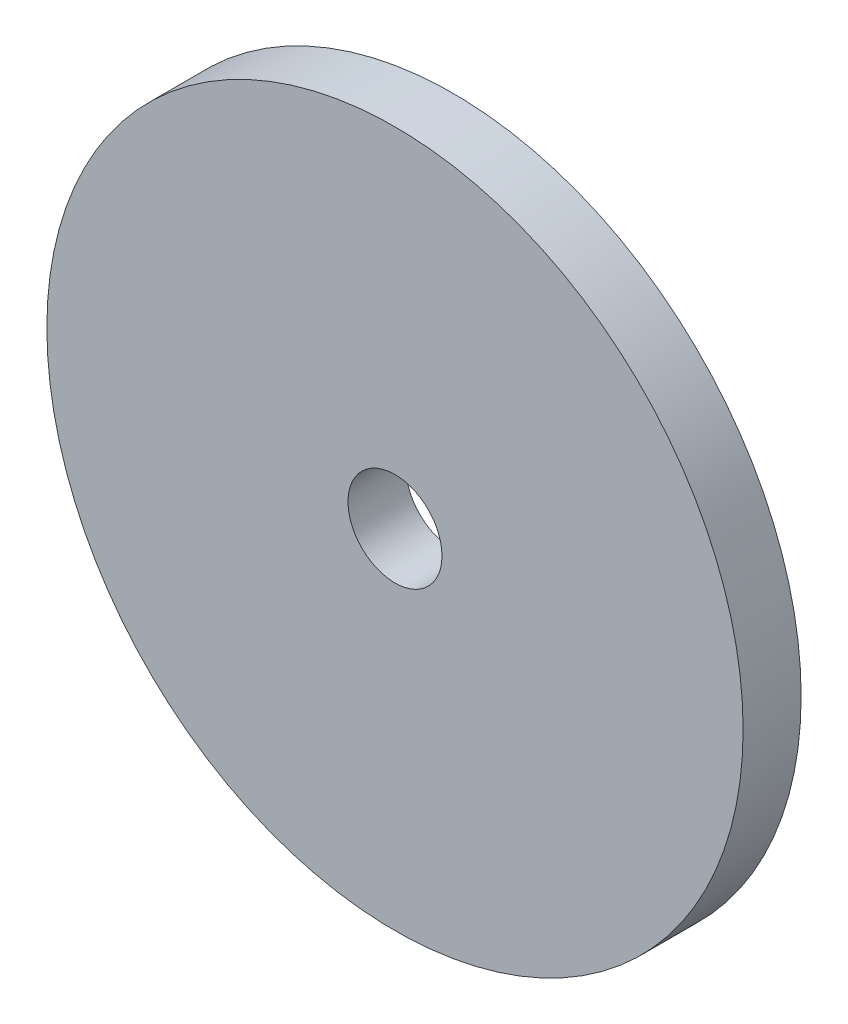
ISO-10303-21;
HEADER;
FILE_DESCRIPTION(('STEP AP214'),'2;1');
FILE_NAME('part.step','',(''),(''),'','','');
FILE_SCHEMA(('AUTOMOTIVE_DESIGN { 1 0 10303 214 1 1 1 1 }'));
ENDSEC;
DATA;
#1=APPLICATION_CONTEXT('core data for automotive mechanical design processes');
#2=APPLICATION_PROTOCOL_DEFINITION('international standard','automotive_design',2000,#1);
#3=PRODUCT_CONTEXT('',#1,'mechanical');
#4=PRODUCT('Part','Part','',(#3));
#5=PRODUCT_RELATED_PRODUCT_CATEGORY('part','',(#4));
#6=PRODUCT_DEFINITION_FORMATION('','',#4);
#7=PRODUCT_DEFINITION_CONTEXT('part definition',#1,'design');
#8=PRODUCT_DEFINITION('design','',#6,#7);
#9=PRODUCT_DEFINITION_SHAPE('','',#8);
#10=(LENGTH_UNIT() NAMED_UNIT(*) SI_UNIT(.MILLI.,.METRE.));
#11=(NAMED_UNIT(*) PLANE_ANGLE_UNIT() SI_UNIT($,.RADIAN.));
#12=(NAMED_UNIT(*) SI_UNIT($,.STERADIAN.) SOLID_ANGLE_UNIT());
#13=UNCERTAINTY_MEASURE_WITH_UNIT(LENGTH_MEASURE(1.E-05),#10,'distance_accuracy_value','');
#14=(GEOMETRIC_REPRESENTATION_CONTEXT(3) GLOBAL_UNCERTAINTY_ASSIGNED_CONTEXT((#13)) GLOBAL_UNIT_ASSIGNED_CONTEXT((#10,
#11,#12)) REPRESENTATION_CONTEXT('',''));
#15=CARTESIAN_POINT('',(0.,0.,0.));
#16=DIRECTION('',(0.,0.,1.));
#17=DIRECTION('',(1.,0.,0.));
#18=AXIS2_PLACEMENT_3D('',#15,#16,#17);
#19=CARTESIAN_POINT('',(0.,0.,5.));
#20=DIRECTION('',(0.,0.,1.));
#21=DIRECTION('',(1.,0.,0.));
#22=AXIS2_PLACEMENT_3D('',#19,#20,#21);
#23=PLANE('',#22);
#24=CARTESIAN_POINT('',(0.,0.,5.));
#25=DIRECTION('',(0.,0.,1.));
#26=DIRECTION('',(1.,0.,0.));
#27=AXIS2_PLACEMENT_3D('',#24,#25,#26);
#28=CIRCLE('',#27,30.);
#29=CARTESIAN_POINT('',(30.,0.,5.));
#30=VERTEX_POINT('',#29);
#31=EDGE_CURVE('E10',#30,#30,#28,.T.);
#32=ORIENTED_EDGE('',*,*,#31,.T.);
#33=EDGE_LOOP('',(#32));
#34=FACE_BOUND('',#33,.T.);
#35=CARTESIAN_POINT('',(0.,0.,5.));
#36=DIRECTION('',(0.,0.,1.));
#37=DIRECTION('',(1.,0.,0.));
#38=AXIS2_PLACEMENT_3D('',#35,#36,#37);
#39=CIRCLE('',#38,4.05);
#40=CARTESIAN_POINT('',(4.05,0.,5.));
#41=VERTEX_POINT('',#40);
#42=EDGE_CURVE('E46',#41,#41,#39,.T.);
#43=ORIENTED_EDGE('',*,*,#42,.F.);
#44=EDGE_LOOP('',(#43));
#45=FACE_BOUND('',#44,.T.);
#46=ADVANCED_FACE('F35',(#34,#45),#23,.T.);
#47=CARTESIAN_POINT('',(0.,0.,0.));
#48=DIRECTION('',(0.,0.,1.));
#49=DIRECTION('',(1.,0.,0.));
#50=AXIS2_PLACEMENT_3D('',#47,#48,#49);
#51=PLANE('',#50);
#52=CARTESIAN_POINT('',(0.,0.,0.));
#53=DIRECTION('',(0.,0.,1.));
#54=DIRECTION('',(1.,0.,0.));
#55=AXIS2_PLACEMENT_3D('',#52,#53,#54);
#56=CIRCLE('',#55,30.);
#57=CARTESIAN_POINT('',(30.,0.,0.));
#58=VERTEX_POINT('',#57);
#59=EDGE_CURVE('E39',#58,#58,#56,.T.);
#60=ORIENTED_EDGE('',*,*,#59,.F.);
#61=EDGE_LOOP('',(#60));
#62=FACE_BOUND('',#61,.T.);
#63=CARTESIAN_POINT('',(0.,0.,0.));
#64=DIRECTION('',(0.,0.,1.));
#65=DIRECTION('',(1.,0.,0.));
#66=AXIS2_PLACEMENT_3D('',#63,#64,#65);
#67=CIRCLE('',#66,4.05);
#68=CARTESIAN_POINT('',(4.05,0.,0.));
#69=VERTEX_POINT('',#68);
#70=EDGE_CURVE('E48',#69,#69,#67,.T.);
#71=ORIENTED_EDGE('',*,*,#70,.T.);
#72=EDGE_LOOP('',(#71));
#73=FACE_BOUND('',#72,.T.);
#74=ADVANCED_FACE('F58',(#62,#73),#51,.F.);
#75=CARTESIAN_POINT('',(0.,0.,5.));
#76=DIRECTION('',(0.,0.,-1.));
#77=DIRECTION('',(-1.,0.,0.));
#78=AXIS2_PLACEMENT_3D('',#75,#76,#77);
#79=CYLINDRICAL_SURFACE('',#78,30.);
#80=ORIENTED_EDGE('',*,*,#31,.F.);
#81=EDGE_LOOP('',(#80));
#82=FACE_BOUND('',#81,.T.);
#83=ORIENTED_EDGE('',*,*,#59,.T.);
#84=EDGE_LOOP('',(#83));
#85=FACE_BOUND('',#84,.T.);
#86=ADVANCED_FACE('F37',(#82,#85),#79,.T.);
#87=CARTESIAN_POINT('',(0.,0.,5.));
#88=DIRECTION('',(0.,0.,-1.));
#89=DIRECTION('',(-1.,0.,0.));
#90=AXIS2_PLACEMENT_3D('',#87,#88,#89);
#91=CYLINDRICAL_SURFACE('',#90,4.05);
#92=ORIENTED_EDGE('',*,*,#42,.T.);
#93=EDGE_LOOP('',(#92));
#94=FACE_BOUND('',#93,.T.);
#95=ORIENTED_EDGE('',*,*,#70,.F.);
#96=EDGE_LOOP('',(#95));
#97=FACE_BOUND('',#96,.T.);
#98=ADVANCED_FACE('F54',(#94,#97),#91,.F.);
#99=CLOSED_SHELL('',(#46,#74,#86,#98));
#100=MANIFOLD_SOLID_BREP('B2',#99);
#101=ADVANCED_BREP_SHAPE_REPRESENTATION('',(#18,#100),#14);
#102=SHAPE_DEFINITION_REPRESENTATION(#9,#101);
ENDSEC;
END-ISO-10303-21;
